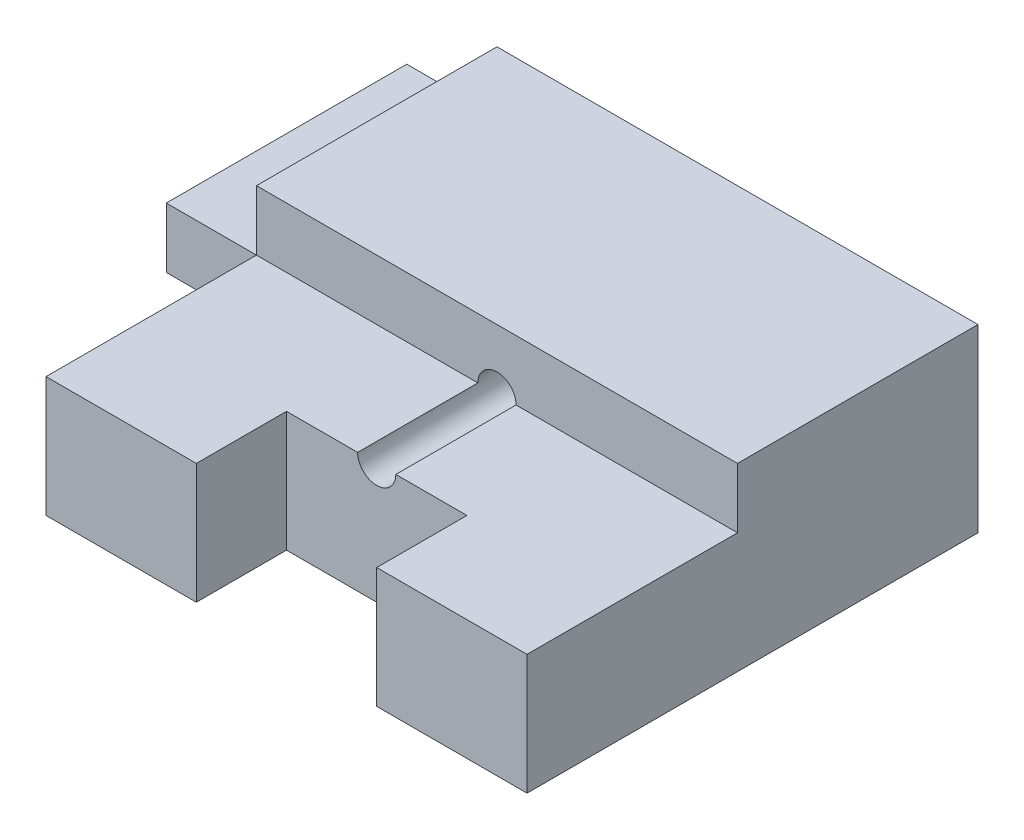
ISO-10303-21;
HEADER;
FILE_DESCRIPTION(('STEP AP214'),'2;1');
FILE_NAME('part.step','',(''),(''),'','','');
FILE_SCHEMA(('AUTOMOTIVE_DESIGN { 1 0 10303 214 1 1 1 1 }'));
ENDSEC;
DATA;
#1=APPLICATION_CONTEXT('core data for automotive mechanical design processes');
#2=APPLICATION_PROTOCOL_DEFINITION('international standard','automotive_design',2000,#1);
#3=PRODUCT_CONTEXT('',#1,'mechanical');
#4=PRODUCT('Part','Part','',(#3));
#5=PRODUCT_RELATED_PRODUCT_CATEGORY('part','',(#4));
#6=PRODUCT_DEFINITION_FORMATION('','',#4);
#7=PRODUCT_DEFINITION_CONTEXT('part definition',#1,'design');
#8=PRODUCT_DEFINITION('design','',#6,#7);
#9=PRODUCT_DEFINITION_SHAPE('','',#8);
#10=(LENGTH_UNIT() NAMED_UNIT(*) SI_UNIT(.MILLI.,.METRE.));
#11=(NAMED_UNIT(*) PLANE_ANGLE_UNIT() SI_UNIT($,.RADIAN.));
#12=(NAMED_UNIT(*) SI_UNIT($,.STERADIAN.) SOLID_ANGLE_UNIT());
#13=UNCERTAINTY_MEASURE_WITH_UNIT(LENGTH_MEASURE(1.E-05),#10,'distance_accuracy_value','');
#14=(GEOMETRIC_REPRESENTATION_CONTEXT(3) GLOBAL_UNCERTAINTY_ASSIGNED_CONTEXT((#13)) GLOBAL_UNIT_ASSIGNED_CONTEXT((#10,
#11,#12)) REPRESENTATION_CONTEXT('',''));
#15=CARTESIAN_POINT('',(0.,0.,0.));
#16=DIRECTION('',(0.,0.,1.));
#17=DIRECTION('',(1.,0.,0.));
#18=AXIS2_PLACEMENT_3D('',#15,#16,#17);
#19=CARTESIAN_POINT('',(-15.9999934,6.,0.));
#20=DIRECTION('',(1.,0.,0.));
#21=DIRECTION('',(0.,0.,-1.));
#22=AXIS2_PLACEMENT_3D('',#19,#20,#21);
#23=PLANE('',#22);
#24=DIRECTION('',(0.,0.,1.));
#25=VECTOR('',#24,1.);
#26=CARTESIAN_POINT('',(-15.9999934,2.,-15.));
#27=LINE('',#26,#25);
#28=CARTESIAN_POINT('',(-15.9999934,2.,-15.));
#29=VERTEX_POINT('',#28);
#30=CARTESIAN_POINT('',(-15.9999934,2.,-7.));
#31=VERTEX_POINT('',#30);
#32=EDGE_CURVE('E55',#29,#31,#27,.T.);
#33=ORIENTED_EDGE('',*,*,#32,.F.);
#34=DIRECTION('',(0.,-1.,0.));
#35=VECTOR('',#34,1.);
#36=CARTESIAN_POINT('',(-15.9999934,6.,-15.));
#37=LINE('',#36,#35);
#38=CARTESIAN_POINT('',(-15.9999934,0.,-15.));
#39=VERTEX_POINT('',#38);
#40=EDGE_CURVE('E283',#29,#39,#37,.T.);
#41=ORIENTED_EDGE('',*,*,#40,.T.);
#42=DIRECTION('',(0.,0.,1.));
#43=VECTOR('',#42,1.);
#44=CARTESIAN_POINT('',(-15.9999934,0.,0.));
#45=LINE('',#44,#43);
#46=CARTESIAN_POINT('',(-15.9999934,0.,0.));
#47=VERTEX_POINT('',#46);
#48=EDGE_CURVE('E235',#39,#47,#45,.T.);
#49=ORIENTED_EDGE('',*,*,#48,.T.);
#50=DIRECTION('',(0.,-1.,0.));
#51=VECTOR('',#50,1.);
#52=CARTESIAN_POINT('',(-15.9999934,6.,0.));
#53=LINE('',#52,#51);
#54=CARTESIAN_POINT('',(-15.9999934,4.,0.));
#55=VERTEX_POINT('',#54);
#56=EDGE_CURVE('E243',#55,#47,#53,.T.);
#57=ORIENTED_EDGE('',*,*,#56,.F.);
#58=DIRECTION('',(0.,0.,1.));
#59=VECTOR('',#58,1.);
#60=CARTESIAN_POINT('',(-15.9999934,4.,0.));
#61=LINE('',#60,#59);
#62=CARTESIAN_POINT('',(-15.9999934,4.,-7.));
#63=VERTEX_POINT('',#62);
#64=EDGE_CURVE('E213',#63,#55,#61,.T.);
#65=ORIENTED_EDGE('',*,*,#64,.F.);
#66=DIRECTION('',(0.,1.,0.));
#67=VECTOR('',#66,1.);
#68=CARTESIAN_POINT('',(-15.9999934,4.,-7.));
#69=LINE('',#68,#67);
#70=EDGE_CURVE('E51',#31,#63,#69,.T.);
#71=ORIENTED_EDGE('',*,*,#70,.F.);
#72=EDGE_LOOP('',(#33,#41,#49,#57,#65,#71));
#73=FACE_BOUND('',#72,.T.);
#74=ADVANCED_FACE('F36',(#73),#23,.F.);
#75=DIRECTION('',(0.,0.,-1.));
#76=VECTOR('',#75,1.);
#77=CARTESIAN_POINT('',(-15.9999934,4.,-15.));
#78=LINE('',#77,#76);
#79=CARTESIAN_POINT('',(-15.9999934,4.,-15.));
#80=VERTEX_POINT('',#79);
#81=EDGE_CURVE('E319',#63,#80,#78,.T.);
#82=ORIENTED_EDGE('',*,*,#81,.F.);
#83=DIRECTION('',(0.,1.,0.));
#84=VECTOR('',#83,1.);
#85=CARTESIAN_POINT('',(-15.9999934,4.,-7.));
#86=LINE('',#85,#84);
#87=CARTESIAN_POINT('',(-15.9999934,6.,-7.));
#88=VERTEX_POINT('',#87);
#89=EDGE_CURVE('E216',#63,#88,#86,.T.);
#90=ORIENTED_EDGE('',*,*,#89,.T.);
#91=DIRECTION('',(0.,0.,1.));
#92=VECTOR('',#91,1.);
#93=CARTESIAN_POINT('',(-15.9999934,6.,0.));
#94=LINE('',#93,#92);
#95=CARTESIAN_POINT('',(-15.9999934,6.,-15.));
#96=VERTEX_POINT('',#95);
#97=EDGE_CURVE('E226',#96,#88,#94,.T.);
#98=ORIENTED_EDGE('',*,*,#97,.F.);
#99=EDGE_CURVE('E284',#96,#80,#37,.T.);
#100=ORIENTED_EDGE('',*,*,#99,.T.);
#101=EDGE_LOOP('',(#82,#90,#98,#100));
#102=FACE_BOUND('',#101,.T.);
#103=ADVANCED_FACE('F318',(#102),#23,.F.);
#104=CARTESIAN_POINT('',(0.,4.,0.));
#105=DIRECTION('',(0.,-1.,0.));
#106=DIRECTION('',(0.,0.,-1.));
#107=AXIS2_PLACEMENT_3D('',#104,#105,#106);
#108=PLANE('',#107);
#109=DIRECTION('',(-1.,0.,0.));
#110=VECTOR('',#109,1.);
#111=CARTESIAN_POINT('',(-11.,4.,-3.));
#112=LINE('',#111,#110);
#113=CARTESIAN_POINT('',(-8.6349967,4.,-3.));
#114=VERTEX_POINT('',#113);
#115=CARTESIAN_POINT('',(-11.,4.,-3.));
#116=VERTEX_POINT('',#115);
#117=EDGE_CURVE('E189',#114,#116,#112,.T.);
#118=ORIENTED_EDGE('',*,*,#117,.F.);
#119=DIRECTION('',(0.,0.,-1.));
#120=VECTOR('',#119,1.);
#121=CARTESIAN_POINT('',(-8.63499669999999,4.,85.));
#122=LINE('',#121,#120);
#123=CARTESIAN_POINT('',(-8.6349967,4.,-7.00000000000001));
#124=VERTEX_POINT('',#123);
#125=EDGE_CURVE('E178',#114,#124,#122,.T.);
#126=ORIENTED_EDGE('',*,*,#125,.T.);
#127=DIRECTION('',(-1.,0.,0.));
#128=VECTOR('',#127,1.);
#129=CARTESIAN_POINT('',(-15.9999934,4.,-7.));
#130=LINE('',#129,#128);
#131=EDGE_CURVE('E252',#124,#63,#130,.T.);
#132=ORIENTED_EDGE('',*,*,#131,.T.);
#133=ORIENTED_EDGE('',*,*,#64,.T.);
#134=DIRECTION('',(1.,0.,0.));
#135=VECTOR('',#134,1.);
#136=CARTESIAN_POINT('',(-15.9999934,4.,0.));
#137=LINE('',#136,#135);
#138=CARTESIAN_POINT('',(-11.,4.,0.));
#139=VERTEX_POINT('',#138);
#140=EDGE_CURVE('E253',#55,#139,#137,.T.);
#141=ORIENTED_EDGE('',*,*,#140,.T.);
#142=DIRECTION('',(0.,0.,1.));
#143=VECTOR('',#142,1.);
#144=CARTESIAN_POINT('',(-11.,4.,0.));
#145=LINE('',#144,#143);
#146=EDGE_CURVE('E184',#116,#139,#145,.T.);
#147=ORIENTED_EDGE('',*,*,#146,.F.);
#148=EDGE_LOOP('',(#118,#126,#132,#133,#141,#147));
#149=FACE_BOUND('',#148,.T.);
#150=ADVANCED_FACE('F274',(#149),#108,.F.);
#151=CARTESIAN_POINT('',(0.,6.,0.));
#152=DIRECTION('',(0.,0.,-1.));
#153=DIRECTION('',(-1.,0.,0.));
#154=AXIS2_PLACEMENT_3D('',#151,#152,#153);
#155=PLANE('',#154);
#156=DIRECTION('',(1.,0.,0.));
#157=VECTOR('',#156,1.);
#158=CARTESIAN_POINT('',(0.,0.,0.));
#159=LINE('',#158,#157);
#160=CARTESIAN_POINT('',(-11.,0.,0.));
#161=VERTEX_POINT('',#160);
#162=EDGE_CURVE('E224',#47,#161,#159,.T.);
#163=ORIENTED_EDGE('',*,*,#162,.T.);
#164=DIRECTION('',(0.,1.,0.));
#165=VECTOR('',#164,1.);
#166=CARTESIAN_POINT('',(-11.,-2.49999999998515E-05,0.));
#167=LINE('',#166,#165);
#168=EDGE_CURVE('E193',#161,#139,#167,.T.);
#169=ORIENTED_EDGE('',*,*,#168,.T.);
#170=ORIENTED_EDGE('',*,*,#140,.F.);
#171=ORIENTED_EDGE('',*,*,#56,.T.);
#172=EDGE_LOOP('',(#163,#169,#170,#171));
#173=FACE_BOUND('',#172,.T.);
#174=ADVANCED_FACE('F299',(#173),#155,.F.);
#175=CARTESIAN_POINT('',(0.,6.,0.));
#176=DIRECTION('',(-1.,0.,0.));
#177=DIRECTION('',(0.,0.,1.));
#178=AXIS2_PLACEMENT_3D('',#175,#176,#177);
#179=PLANE('',#178);
#180=DIRECTION('',(0.,1.,0.));
#181=VECTOR('',#180,1.);
#182=CARTESIAN_POINT('',(0.,4.,-7.));
#183=LINE('',#182,#181);
#184=CARTESIAN_POINT('',(3.30000000069164E-06,4.,-7.));
#185=VERTEX_POINT('',#184);
#186=CARTESIAN_POINT('',(0.,6.,-7.));
#187=VERTEX_POINT('',#186);
#188=EDGE_CURVE('E220',#185,#187,#183,.T.);
#189=ORIENTED_EDGE('',*,*,#188,.F.);
#190=DIRECTION('',(0.,0.,-1.));
#191=VECTOR('',#190,1.);
#192=CARTESIAN_POINT('',(6.60000000138328E-06,4.,0.));
#193=LINE('',#192,#191);
#194=CARTESIAN_POINT('',(6.60000000138328E-06,4.,0.));
#195=VERTEX_POINT('',#194);
#196=EDGE_CURVE('E250',#195,#185,#193,.T.);
#197=ORIENTED_EDGE('',*,*,#196,.F.);
#198=DIRECTION('',(0.,-1.,0.));
#199=VECTOR('',#198,1.);
#200=CARTESIAN_POINT('',(0.,6.,0.));
#201=LINE('',#200,#199);
#202=CARTESIAN_POINT('',(0.,0.,0.));
#203=VERTEX_POINT('',#202);
#204=EDGE_CURVE('E229',#195,#203,#201,.T.);
#205=ORIENTED_EDGE('',*,*,#204,.T.);
#206=DIRECTION('',(0.,0.,-1.));
#207=VECTOR('',#206,1.);
#208=CARTESIAN_POINT('',(0.,0.,0.));
#209=LINE('',#208,#207);
#210=CARTESIAN_POINT('',(0.,0.,-15.));
#211=VERTEX_POINT('',#210);
#212=EDGE_CURVE('E219',#203,#211,#209,.T.);
#213=ORIENTED_EDGE('',*,*,#212,.T.);
#214=DIRECTION('',(0.,-1.,0.));
#215=VECTOR('',#214,1.);
#216=CARTESIAN_POINT('',(0.,6.,-15.));
#217=LINE('',#216,#215);
#218=CARTESIAN_POINT('',(0.,6.,-15.));
#219=VERTEX_POINT('',#218);
#220=EDGE_CURVE('E44',#219,#211,#217,.T.);
#221=ORIENTED_EDGE('',*,*,#220,.F.);
#222=DIRECTION('',(0.,0.,-1.));
#223=VECTOR('',#222,1.);
#224=CARTESIAN_POINT('',(0.,6.,0.));
#225=LINE('',#224,#223);
#226=EDGE_CURVE('E221',#187,#219,#225,.T.);
#227=ORIENTED_EDGE('',*,*,#226,.F.);
#228=EDGE_LOOP('',(#189,#197,#205,#213,#221,#227));
#229=FACE_BOUND('',#228,.T.);
#230=ADVANCED_FACE('F38',(#229),#179,.F.);
#231=CARTESIAN_POINT('',(0.,6.,-15.));
#232=DIRECTION('',(0.,0.,1.));
#233=DIRECTION('',(1.,0.,0.));
#234=AXIS2_PLACEMENT_3D('',#231,#232,#233);
#235=PLANE('',#234);
#236=CARTESIAN_POINT('',(-7.9999967,4.,-15.));
#237=DIRECTION('',(0.,0.,-1.));
#238=DIRECTION('',(-1.,0.,0.));
#239=AXIS2_PLACEMENT_3D('',#236,#237,#238);
#240=CIRCLE('',#239,0.635000000000001);
#241=CARTESIAN_POINT('',(-8.6349967,4.,-15.));
#242=VERTEX_POINT('',#241);
#243=EDGE_CURVE('E167',#242,#242,#240,.T.);
#244=ORIENTED_EDGE('',*,*,#243,.F.);
#245=EDGE_LOOP('',(#244));
#246=FACE_BOUND('',#245,.T.);
#247=DIRECTION('',(-1.,0.,0.));
#248=VECTOR('',#247,1.);
#249=CARTESIAN_POINT('',(0.,0.,-15.));
#250=LINE('',#249,#248);
#251=EDGE_CURVE('E232',#211,#39,#250,.T.);
#252=ORIENTED_EDGE('',*,*,#251,.T.);
#253=ORIENTED_EDGE('',*,*,#40,.F.);
#254=DIRECTION('',(1.,0.,0.));
#255=VECTOR('',#254,1.);
#256=CARTESIAN_POINT('',(-18.9999934,2.,-15.));
#257=LINE('',#256,#255);
#258=CARTESIAN_POINT('',(-18.9999934,2.,-15.));
#259=VERTEX_POINT('',#258);
#260=EDGE_CURVE('E172',#259,#29,#257,.T.);
#261=ORIENTED_EDGE('',*,*,#260,.F.);
#262=DIRECTION('',(0.,-1.,0.));
#263=VECTOR('',#262,1.);
#264=CARTESIAN_POINT('',(-18.9999934,4.,-15.));
#265=LINE('',#264,#263);
#266=CARTESIAN_POINT('',(-18.9999934,4.,-15.));
#267=VERTEX_POINT('',#266);
#268=EDGE_CURVE('E155',#267,#259,#265,.T.);
#269=ORIENTED_EDGE('',*,*,#268,.F.);
#270=DIRECTION('',(1.,0.,0.));
#271=VECTOR('',#270,1.);
#272=CARTESIAN_POINT('',(-18.9999934,4.,-15.));
#273=LINE('',#272,#271);
#274=EDGE_CURVE('E152',#267,#80,#273,.T.);
#275=ORIENTED_EDGE('',*,*,#274,.T.);
#276=ORIENTED_EDGE('',*,*,#99,.F.);
#277=DIRECTION('',(-1.,0.,0.));
#278=VECTOR('',#277,1.);
#279=CARTESIAN_POINT('',(0.,6.,-15.));
#280=LINE('',#279,#278);
#281=EDGE_CURVE('E223',#219,#96,#280,.T.);
#282=ORIENTED_EDGE('',*,*,#281,.F.);
#283=ORIENTED_EDGE('',*,*,#220,.T.);
#284=EDGE_LOOP('',(#252,#253,#261,#269,#275,#276,#282,#283));
#285=FACE_BOUND('',#284,.T.);
#286=ADVANCED_FACE('F290',(#246,#285),#235,.F.);
#287=CARTESIAN_POINT('',(-5.00000000000001,4.,0.));
#288=VERTEX_POINT('',#287);
#289=EDGE_CURVE('E215',#288,#195,#137,.T.);
#290=ORIENTED_EDGE('',*,*,#289,.F.);
#291=DIRECTION('',(0.,1.,0.));
#292=VECTOR('',#291,1.);
#293=CARTESIAN_POINT('',(-5.00000000000001,-2.49999999998515E-05,0.));
#294=LINE('',#293,#292);
#295=CARTESIAN_POINT('',(-5.00000000000001,0.,0.));
#296=VERTEX_POINT('',#295);
#297=EDGE_CURVE('E200',#296,#288,#294,.T.);
#298=ORIENTED_EDGE('',*,*,#297,.F.);
#299=EDGE_CURVE('E238',#296,#203,#159,.T.);
#300=ORIENTED_EDGE('',*,*,#299,.T.);
#301=ORIENTED_EDGE('',*,*,#204,.F.);
#302=EDGE_LOOP('',(#290,#298,#300,#301));
#303=FACE_BOUND('',#302,.T.);
#304=ADVANCED_FACE('F313',(#303),#155,.F.);
#305=CARTESIAN_POINT('',(0.,6.,0.));
#306=DIRECTION('',(0.,1.,0.));
#307=DIRECTION('',(0.,0.,1.));
#308=AXIS2_PLACEMENT_3D('',#305,#306,#307);
#309=PLANE('',#308);
#310=DIRECTION('',(-1.,0.,0.));
#311=VECTOR('',#310,1.);
#312=CARTESIAN_POINT('',(-15.9999934,6.,-7.));
#313=LINE('',#312,#311);
#314=EDGE_CURVE('E212',#187,#88,#313,.T.);
#315=ORIENTED_EDGE('',*,*,#314,.F.);
#316=ORIENTED_EDGE('',*,*,#226,.T.);
#317=ORIENTED_EDGE('',*,*,#281,.T.);
#318=ORIENTED_EDGE('',*,*,#97,.T.);
#319=EDGE_LOOP('',(#315,#316,#317,#318));
#320=FACE_BOUND('',#319,.T.);
#321=ADVANCED_FACE('F317',(#320),#309,.T.);
#322=CARTESIAN_POINT('',(0.,0.,0.));
#323=DIRECTION('',(0.,1.,0.));
#324=DIRECTION('',(0.,0.,1.));
#325=AXIS2_PLACEMENT_3D('',#322,#323,#324);
#326=PLANE('',#325);
#327=DIRECTION('',(-1.,0.,0.));
#328=VECTOR('',#327,1.);
#329=CARTESIAN_POINT('',(0.,0.,-3.));
#330=LINE('',#329,#328);
#331=CARTESIAN_POINT('',(-5.00000000000001,0.,-3.));
#332=VERTEX_POINT('',#331);
#333=CARTESIAN_POINT('',(-11.,0.,-3.));
#334=VERTEX_POINT('',#333);
#335=EDGE_CURVE('E206',#332,#334,#330,.T.);
#336=ORIENTED_EDGE('',*,*,#335,.T.);
#337=DIRECTION('',(0.,0.,1.));
#338=VECTOR('',#337,1.);
#339=CARTESIAN_POINT('',(-11.,0.,0.));
#340=LINE('',#339,#338);
#341=EDGE_CURVE('E209',#334,#161,#340,.T.);
#342=ORIENTED_EDGE('',*,*,#341,.T.);
#343=ORIENTED_EDGE('',*,*,#162,.F.);
#344=ORIENTED_EDGE('',*,*,#48,.F.);
#345=ORIENTED_EDGE('',*,*,#251,.F.);
#346=ORIENTED_EDGE('',*,*,#212,.F.);
#347=ORIENTED_EDGE('',*,*,#299,.F.);
#348=DIRECTION('',(0.,0.,-1.));
#349=VECTOR('',#348,1.);
#350=CARTESIAN_POINT('',(-5.00000000000001,0.,0.));
#351=LINE('',#350,#349);
#352=EDGE_CURVE('E197',#296,#332,#351,.T.);
#353=ORIENTED_EDGE('',*,*,#352,.T.);
#354=EDGE_LOOP('',(#336,#342,#343,#344,#345,#346,#347,#353));
#355=FACE_BOUND('',#354,.T.);
#356=ADVANCED_FACE('F298',(#355),#326,.F.);
#357=CARTESIAN_POINT('',(-15.9999934,4.,-7.));
#358=DIRECTION('',(0.,0.,-1.));
#359=DIRECTION('',(-1.,0.,0.));
#360=AXIS2_PLACEMENT_3D('',#357,#358,#359);
#361=PLANE('',#360);
#362=ORIENTED_EDGE('',*,*,#131,.F.);
#363=CARTESIAN_POINT('',(-7.9999967,4.,-7.00000000000001));
#364=DIRECTION('',(0.,0.,-1.));
#365=DIRECTION('',(-1.,0.,0.));
#366=AXIS2_PLACEMENT_3D('',#363,#364,#365);
#367=CIRCLE('',#366,0.635000000000001);
#368=CARTESIAN_POINT('',(-7.3649967,4.,-7.00000000000001));
#369=VERTEX_POINT('',#368);
#370=EDGE_CURVE('E181',#124,#369,#367,.T.);
#371=ORIENTED_EDGE('',*,*,#370,.T.);
#372=EDGE_CURVE('E260',#185,#369,#130,.T.);
#373=ORIENTED_EDGE('',*,*,#372,.F.);
#374=ORIENTED_EDGE('',*,*,#188,.T.);
#375=ORIENTED_EDGE('',*,*,#314,.T.);
#376=ORIENTED_EDGE('',*,*,#89,.F.);
#377=EDGE_LOOP('',(#362,#371,#373,#374,#375,#376));
#378=FACE_BOUND('',#377,.T.);
#379=ADVANCED_FACE('F276',(#378),#361,.F.);
#380=ORIENTED_EDGE('',*,*,#372,.T.);
#381=DIRECTION('',(0.,0.,-1.));
#382=VECTOR('',#381,1.);
#383=CARTESIAN_POINT('',(-7.36499669999999,4.,85.));
#384=LINE('',#383,#382);
#385=CARTESIAN_POINT('',(-7.3649967,4.,-3.));
#386=VERTEX_POINT('',#385);
#387=EDGE_CURVE('E170',#369,#386,#384,.F.);
#388=ORIENTED_EDGE('',*,*,#387,.T.);
#389=CARTESIAN_POINT('',(-5.00000000000001,4.,-3.));
#390=VERTEX_POINT('',#389);
#391=EDGE_CURVE('E190',#390,#386,#112,.T.);
#392=ORIENTED_EDGE('',*,*,#391,.F.);
#393=DIRECTION('',(0.,0.,-1.));
#394=VECTOR('',#393,1.);
#395=CARTESIAN_POINT('',(-5.00000000000001,4.,0.));
#396=LINE('',#395,#394);
#397=EDGE_CURVE('E186',#288,#390,#396,.T.);
#398=ORIENTED_EDGE('',*,*,#397,.F.);
#399=ORIENTED_EDGE('',*,*,#289,.T.);
#400=ORIENTED_EDGE('',*,*,#196,.T.);
#401=EDGE_LOOP('',(#380,#388,#392,#398,#399,#400));
#402=FACE_BOUND('',#401,.T.);
#403=ADVANCED_FACE('F314',(#402),#108,.F.);
#404=CARTESIAN_POINT('',(-11.,-2.49999999998515E-05,0.));
#405=DIRECTION('',(-1.,0.,0.));
#406=DIRECTION('',(0.,0.,1.));
#407=AXIS2_PLACEMENT_3D('',#404,#405,#406);
#408=PLANE('',#407);
#409=DIRECTION('',(0.,1.,0.));
#410=VECTOR('',#409,1.);
#411=CARTESIAN_POINT('',(-11.,-2.49999999998515E-05,-3.));
#412=LINE('',#411,#410);
#413=EDGE_CURVE('E194',#334,#116,#412,.T.);
#414=ORIENTED_EDGE('',*,*,#413,.T.);
#415=ORIENTED_EDGE('',*,*,#146,.T.);
#416=ORIENTED_EDGE('',*,*,#168,.F.);
#417=ORIENTED_EDGE('',*,*,#341,.F.);
#418=EDGE_LOOP('',(#414,#415,#416,#417));
#419=FACE_BOUND('',#418,.T.);
#420=ADVANCED_FACE('F302',(#419),#408,.F.);
#421=CARTESIAN_POINT('',(-11.,-2.49999999998515E-05,-3.));
#422=DIRECTION('',(0.,0.,-1.));
#423=DIRECTION('',(-1.,0.,0.));
#424=AXIS2_PLACEMENT_3D('',#421,#422,#423);
#425=PLANE('',#424);
#426=ORIENTED_EDGE('',*,*,#391,.T.);
#427=CARTESIAN_POINT('',(-7.9999967,4.,-3.));
#428=DIRECTION('',(0.,0.,-1.));
#429=DIRECTION('',(-1.,0.,0.));
#430=AXIS2_PLACEMENT_3D('',#427,#428,#429);
#431=CIRCLE('',#430,0.635000000000001);
#432=EDGE_CURVE('E11',#386,#114,#431,.T.);
#433=ORIENTED_EDGE('',*,*,#432,.T.);
#434=ORIENTED_EDGE('',*,*,#117,.T.);
#435=ORIENTED_EDGE('',*,*,#413,.F.);
#436=ORIENTED_EDGE('',*,*,#335,.F.);
#437=DIRECTION('',(0.,1.,0.));
#438=VECTOR('',#437,1.);
#439=CARTESIAN_POINT('',(-5.00000000000001,-2.49999999998515E-05,-3.));
#440=LINE('',#439,#438);
#441=EDGE_CURVE('E198',#332,#390,#440,.T.);
#442=ORIENTED_EDGE('',*,*,#441,.T.);
#443=EDGE_LOOP('',(#426,#433,#434,#435,#436,#442));
#444=FACE_BOUND('',#443,.T.);
#445=ADVANCED_FACE('F305',(#444),#425,.F.);
#446=CARTESIAN_POINT('',(-5.00000000000001,-2.49999999998515E-05,0.));
#447=DIRECTION('',(1.,0.,0.));
#448=DIRECTION('',(0.,0.,-1.));
#449=AXIS2_PLACEMENT_3D('',#446,#447,#448);
#450=PLANE('',#449);
#451=ORIENTED_EDGE('',*,*,#297,.T.);
#452=ORIENTED_EDGE('',*,*,#397,.T.);
#453=ORIENTED_EDGE('',*,*,#441,.F.);
#454=ORIENTED_EDGE('',*,*,#352,.F.);
#455=EDGE_LOOP('',(#451,#452,#453,#454));
#456=FACE_BOUND('',#455,.T.);
#457=ADVANCED_FACE('F309',(#456),#450,.F.);
#458=CARTESIAN_POINT('',(-7.99999669999999,4.,85.));
#459=DIRECTION('',(0.,0.,-1.));
#460=DIRECTION('',(-1.,0.,0.));
#461=AXIS2_PLACEMENT_3D('',#458,#459,#460);
#462=CYLINDRICAL_SURFACE('',#461,0.635000000000001);
#463=ORIENTED_EDGE('',*,*,#243,.T.);
#464=EDGE_LOOP('',(#463));
#465=FACE_BOUND('',#464,.T.);
#466=ORIENTED_EDGE('',*,*,#125,.F.);
#467=ORIENTED_EDGE('',*,*,#432,.F.);
#468=ORIENTED_EDGE('',*,*,#387,.F.);
#469=ORIENTED_EDGE('',*,*,#370,.F.);
#470=EDGE_LOOP('',(#466,#467,#468,#469));
#471=FACE_BOUND('',#470,.T.);
#472=ADVANCED_FACE('F337',(#465,#471),#462,.F.);
#473=CARTESIAN_POINT('',(-18.9999934,4.,-7.));
#474=DIRECTION('',(0.,0.,-1.));
#475=DIRECTION('',(0.,1.,0.));
#476=AXIS2_PLACEMENT_3D('',#473,#474,#475);
#477=PLANE('',#476);
#478=ORIENTED_EDGE('',*,*,#70,.T.);
#479=DIRECTION('',(1.,0.,0.));
#480=VECTOR('',#479,1.);
#481=CARTESIAN_POINT('',(-18.9999934,4.,-7.));
#482=LINE('',#481,#480);
#483=CARTESIAN_POINT('',(-18.9999934,4.,-7.));
#484=VERTEX_POINT('',#483);
#485=EDGE_CURVE('E150',#484,#63,#482,.T.);
#486=ORIENTED_EDGE('',*,*,#485,.F.);
#487=DIRECTION('',(0.,1.,0.));
#488=VECTOR('',#487,1.);
#489=CARTESIAN_POINT('',(-18.9999934,4.,-7.));
#490=LINE('',#489,#488);
#491=CARTESIAN_POINT('',(-18.9999934,2.,-7.));
#492=VERTEX_POINT('',#491);
#493=EDGE_CURVE('E156',#492,#484,#490,.T.);
#494=ORIENTED_EDGE('',*,*,#493,.F.);
#495=DIRECTION('',(1.,0.,0.));
#496=VECTOR('',#495,1.);
#497=CARTESIAN_POINT('',(-18.9999934,2.,-7.));
#498=LINE('',#497,#496);
#499=EDGE_CURVE('E447',#492,#31,#498,.T.);
#500=ORIENTED_EDGE('',*,*,#499,.T.);
#501=EDGE_LOOP('',(#478,#486,#494,#500));
#502=FACE_BOUND('',#501,.T.);
#503=ADVANCED_FACE('F166',(#502),#477,.F.);
#504=CARTESIAN_POINT('',(-18.9999934,4.,-15.));
#505=DIRECTION('',(0.,-1.,0.));
#506=DIRECTION('',(0.,0.,-1.));
#507=AXIS2_PLACEMENT_3D('',#504,#505,#506);
#508=PLANE('',#507);
#509=ORIENTED_EDGE('',*,*,#81,.T.);
#510=ORIENTED_EDGE('',*,*,#274,.F.);
#511=DIRECTION('',(0.,0.,-1.));
#512=VECTOR('',#511,1.);
#513=CARTESIAN_POINT('',(-18.9999934,4.,-15.));
#514=LINE('',#513,#512);
#515=EDGE_CURVE('E145',#484,#267,#514,.T.);
#516=ORIENTED_EDGE('',*,*,#515,.F.);
#517=ORIENTED_EDGE('',*,*,#485,.T.);
#518=EDGE_LOOP('',(#509,#510,#516,#517));
#519=FACE_BOUND('',#518,.T.);
#520=ADVANCED_FACE('F148',(#519),#508,.F.);
#521=CARTESIAN_POINT('',(-18.9999934,2.,-15.));
#522=DIRECTION('',(0.,1.,0.));
#523=DIRECTION('',(0.,0.,1.));
#524=AXIS2_PLACEMENT_3D('',#521,#522,#523);
#525=PLANE('',#524);
#526=ORIENTED_EDGE('',*,*,#32,.T.);
#527=ORIENTED_EDGE('',*,*,#499,.F.);
#528=DIRECTION('',(0.,0.,1.));
#529=VECTOR('',#528,1.);
#530=CARTESIAN_POINT('',(-18.9999934,2.,-15.));
#531=LINE('',#530,#529);
#532=EDGE_CURVE('E161',#259,#492,#531,.T.);
#533=ORIENTED_EDGE('',*,*,#532,.F.);
#534=ORIENTED_EDGE('',*,*,#260,.T.);
#535=EDGE_LOOP('',(#526,#527,#533,#534));
#536=FACE_BOUND('',#535,.T.);
#537=ADVANCED_FACE('F426',(#536),#525,.F.);
#538=CARTESIAN_POINT('',(-18.9999934,0.,0.));
#539=DIRECTION('',(-1.,0.,0.));
#540=DIRECTION('',(0.,0.,1.));
#541=AXIS2_PLACEMENT_3D('',#538,#539,#540);
#542=PLANE('',#541);
#543=ORIENTED_EDGE('',*,*,#493,.T.);
#544=ORIENTED_EDGE('',*,*,#515,.T.);
#545=ORIENTED_EDGE('',*,*,#268,.T.);
#546=ORIENTED_EDGE('',*,*,#532,.T.);
#547=EDGE_LOOP('',(#543,#544,#545,#546));
#548=FACE_BOUND('',#547,.T.);
#549=ADVANCED_FACE('F159',(#548),#542,.T.);
#550=CLOSED_SHELL('',(#74,#103,#150,#174,#230,#286,#304,#321,#356,#379,#403,#420,#445,#457,#472,
#503,#520,#537,#549));
#551=MANIFOLD_SOLID_BREP('B2',#550);
#552=ADVANCED_BREP_SHAPE_REPRESENTATION('',(#18,#551),#14);
#553=SHAPE_DEFINITION_REPRESENTATION(#9,#552);
ENDSEC;
END-ISO-10303-21;
